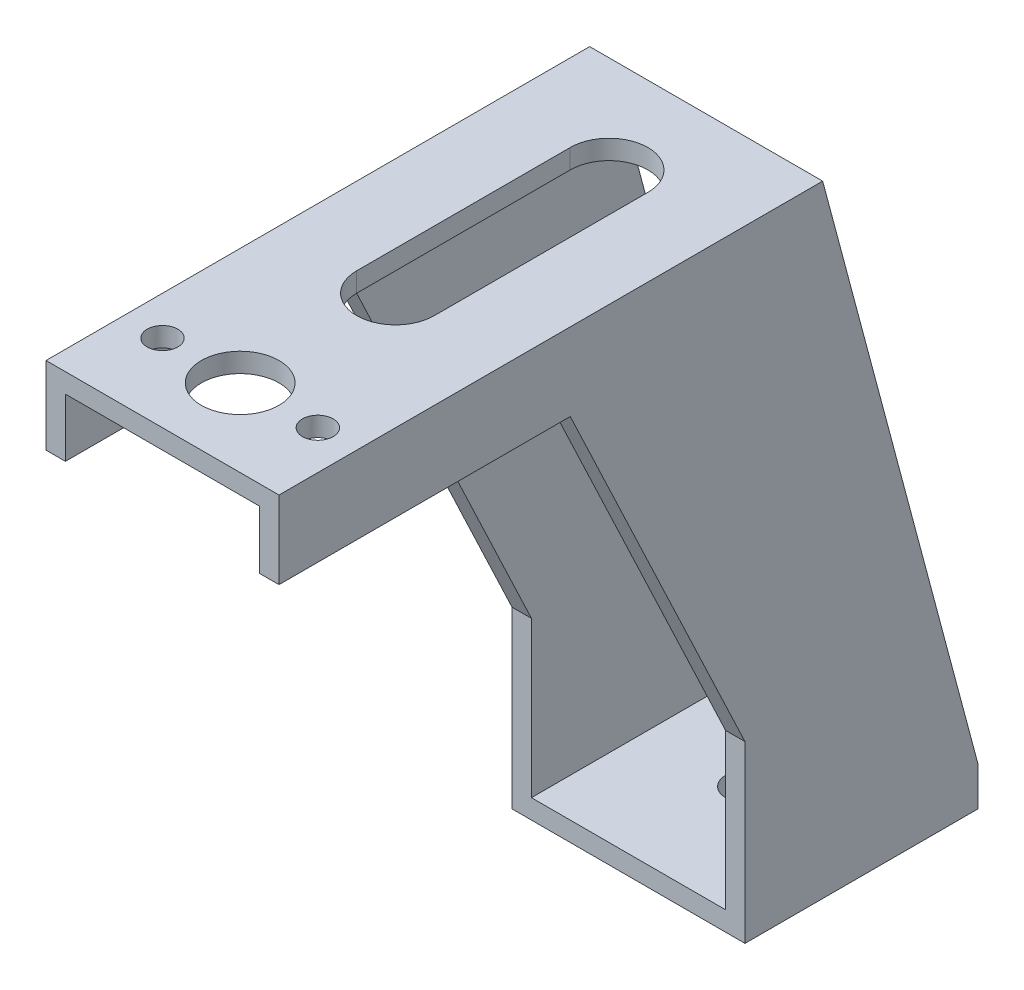
ISO-10303-21;
HEADER;
FILE_DESCRIPTION(('STEP AP214'),'2;1');
FILE_NAME('part.step','',(''),(''),'','','');
FILE_SCHEMA(('AUTOMOTIVE_DESIGN { 1 0 10303 214 1 1 1 1 }'));
ENDSEC;
DATA;
#1=APPLICATION_CONTEXT('core data for automotive mechanical design processes');
#2=APPLICATION_PROTOCOL_DEFINITION('international standard','automotive_design',2000,#1);
#3=PRODUCT_CONTEXT('',#1,'mechanical');
#4=PRODUCT('Part','Part','',(#3));
#5=PRODUCT_RELATED_PRODUCT_CATEGORY('part','',(#4));
#6=PRODUCT_DEFINITION_FORMATION('','',#4);
#7=PRODUCT_DEFINITION_CONTEXT('part definition',#1,'design');
#8=PRODUCT_DEFINITION('design','',#6,#7);
#9=PRODUCT_DEFINITION_SHAPE('','',#8);
#10=(LENGTH_UNIT() NAMED_UNIT(*) SI_UNIT(.MILLI.,.METRE.));
#11=(NAMED_UNIT(*) PLANE_ANGLE_UNIT() SI_UNIT($,.RADIAN.));
#12=(NAMED_UNIT(*) SI_UNIT($,.STERADIAN.) SOLID_ANGLE_UNIT());
#13=UNCERTAINTY_MEASURE_WITH_UNIT(LENGTH_MEASURE(1.E-05),#10,'distance_accuracy_value','');
#14=(GEOMETRIC_REPRESENTATION_CONTEXT(3) GLOBAL_UNCERTAINTY_ASSIGNED_CONTEXT((#13)) GLOBAL_UNIT_ASSIGNED_CONTEXT((#10,
#11,#12)) REPRESENTATION_CONTEXT('',''));
#15=CARTESIAN_POINT('',(0.,0.,0.));
#16=DIRECTION('',(0.,0.,1.));
#17=DIRECTION('',(1.,0.,0.));
#18=AXIS2_PLACEMENT_3D('',#15,#16,#17);
#19=CARTESIAN_POINT('',(0.,0.,114.3));
#20=DIRECTION('',(0.,0.,-1.));
#21=DIRECTION('',(-1.,0.,0.));
#22=AXIS2_PLACEMENT_3D('',#19,#20,#21);
#23=PLANE('',#22);
#24=DIRECTION('',(-1.,0.,0.));
#25=VECTOR('',#24,1.);
#26=CARTESIAN_POINT('',(38.1,88.9,114.3));
#27=LINE('',#26,#25);
#28=CARTESIAN_POINT('',(38.1,88.9,114.3));
#29=VERTEX_POINT('',#28);
#30=CARTESIAN_POINT('',(34.925,88.9,114.3));
#31=VERTEX_POINT('',#30);
#32=EDGE_CURVE('E253',#29,#31,#27,.T.);
#33=ORIENTED_EDGE('',*,*,#32,.F.);
#34=DIRECTION('',(0.,1.,0.));
#35=VECTOR('',#34,1.);
#36=CARTESIAN_POINT('',(38.1,0.,114.3));
#37=LINE('',#36,#35);
#38=CARTESIAN_POINT('',(38.1,101.6,114.3));
#39=VERTEX_POINT('',#38);
#40=EDGE_CURVE('E322',#29,#39,#37,.T.);
#41=ORIENTED_EDGE('',*,*,#40,.T.);
#42=DIRECTION('',(-1.,0.,0.));
#43=VECTOR('',#42,1.);
#44=CARTESIAN_POINT('',(0.,101.6,114.3));
#45=LINE('',#44,#43);
#46=CARTESIAN_POINT('',(0.,101.6,114.3));
#47=VERTEX_POINT('',#46);
#48=EDGE_CURVE('E325',#39,#47,#45,.T.);
#49=ORIENTED_EDGE('',*,*,#48,.T.);
#50=DIRECTION('',(0.,-1.,0.));
#51=VECTOR('',#50,1.);
#52=CARTESIAN_POINT('',(0.,0.,114.3));
#53=LINE('',#52,#51);
#54=CARTESIAN_POINT('',(0.,88.9,114.3));
#55=VERTEX_POINT('',#54);
#56=EDGE_CURVE('E319',#47,#55,#53,.T.);
#57=ORIENTED_EDGE('',*,*,#56,.T.);
#58=CARTESIAN_POINT('',(3.17500000000001,88.9,114.3));
#59=VERTEX_POINT('',#58);
#60=EDGE_CURVE('E256',#59,#55,#27,.T.);
#61=ORIENTED_EDGE('',*,*,#60,.F.);
#62=DIRECTION('',(0.,-1.,0.));
#63=VECTOR('',#62,1.);
#64=CARTESIAN_POINT('',(3.175,3.175,114.3));
#65=LINE('',#64,#63);
#66=CARTESIAN_POINT('',(3.175,98.425,114.3));
#67=VERTEX_POINT('',#66);
#68=EDGE_CURVE('E293',#67,#59,#65,.T.);
#69=ORIENTED_EDGE('',*,*,#68,.F.);
#70=DIRECTION('',(-1.,0.,0.));
#71=VECTOR('',#70,1.);
#72=CARTESIAN_POINT('',(3.175,98.425,114.3));
#73=LINE('',#72,#71);
#74=CARTESIAN_POINT('',(34.925,98.425,114.3));
#75=VERTEX_POINT('',#74);
#76=EDGE_CURVE('E299',#75,#67,#73,.T.);
#77=ORIENTED_EDGE('',*,*,#76,.F.);
#78=DIRECTION('',(0.,1.,0.));
#79=VECTOR('',#78,1.);
#80=CARTESIAN_POINT('',(34.925,3.175,114.3));
#81=LINE('',#80,#79);
#82=EDGE_CURVE('E296',#31,#75,#81,.T.);
#83=ORIENTED_EDGE('',*,*,#82,.F.);
#84=EDGE_LOOP('',(#33,#41,#49,#57,#61,#69,#77,#83));
#85=FACE_BOUND('',#84,.T.);
#86=ADVANCED_FACE('F35',(#85),#23,.F.);
#87=CARTESIAN_POINT('',(0.,0.,114.3));
#88=DIRECTION('',(1.,0.,0.));
#89=DIRECTION('',(0.,0.,-1.));
#90=AXIS2_PLACEMENT_3D('',#87,#88,#89);
#91=PLANE('',#90);
#92=DIRECTION('',(0.,0.,1.));
#93=VECTOR('',#92,1.);
#94=CARTESIAN_POINT('',(0.,88.9,0.));
#95=LINE('',#94,#93);
#96=CARTESIAN_POINT('',(0.,88.9,66.675));
#97=VERTEX_POINT('',#96);
#98=EDGE_CURVE('E235',#97,#55,#95,.T.);
#99=ORIENTED_EDGE('',*,*,#98,.T.);
#100=ORIENTED_EDGE('',*,*,#56,.F.);
#101=DIRECTION('',(0.,0.,-1.));
#102=VECTOR('',#101,1.);
#103=CARTESIAN_POINT('',(0.,101.6,114.3));
#104=LINE('',#103,#102);
#105=CARTESIAN_POINT('',(0.,101.6,25.4));
#106=VERTEX_POINT('',#105);
#107=EDGE_CURVE('E327',#47,#106,#104,.T.);
#108=ORIENTED_EDGE('',*,*,#107,.T.);
#109=DIRECTION('',(0.,0.966234939601246,0.257662650560332));
#110=VECTOR('',#109,1.);
#111=CARTESIAN_POINT('',(0.,0.421576763485477,-1.58091286307054));
#112=LINE('',#111,#110);
#113=CARTESIAN_POINT('',(0.,6.35,0.));
#114=VERTEX_POINT('',#113);
#115=EDGE_CURVE('E277',#114,#106,#112,.T.);
#116=ORIENTED_EDGE('',*,*,#115,.F.);
#117=DIRECTION('',(0.,-1.,0.));
#118=VECTOR('',#117,1.);
#119=CARTESIAN_POINT('',(0.,0.,0.));
#120=LINE('',#119,#118);
#121=CARTESIAN_POINT('',(0.,0.,0.));
#122=VERTEX_POINT('',#121);
#123=EDGE_CURVE('E318',#114,#122,#120,.T.);
#124=ORIENTED_EDGE('',*,*,#123,.T.);
#125=DIRECTION('',(0.,0.,-1.));
#126=VECTOR('',#125,1.);
#127=CARTESIAN_POINT('',(0.,0.,114.3));
#128=LINE('',#127,#126);
#129=CARTESIAN_POINT('',(0.,0.,38.1));
#130=VERTEX_POINT('',#129);
#131=EDGE_CURVE('E342',#130,#122,#128,.T.);
#132=ORIENTED_EDGE('',*,*,#131,.F.);
#133=DIRECTION('',(0.,1.,0.));
#134=VECTOR('',#133,1.);
#135=CARTESIAN_POINT('',(0.,0.,38.1));
#136=LINE('',#135,#134);
#137=CARTESIAN_POINT('',(0.,28.575,38.1));
#138=VERTEX_POINT('',#137);
#139=EDGE_CURVE('E241',#130,#138,#136,.T.);
#140=ORIENTED_EDGE('',*,*,#139,.T.);
#141=DIRECTION('',(0.,0.903737838893539,0.428086344739045));
#142=VECTOR('',#141,1.);
#143=CARTESIAN_POINT('',(0.,-9.50345022624434,20.0628393665158));
#144=LINE('',#143,#142);
#145=EDGE_CURVE('E248',#138,#97,#144,.T.);
#146=ORIENTED_EDGE('',*,*,#145,.T.);
#147=EDGE_LOOP('',(#99,#100,#108,#116,#124,#132,#140,#146));
#148=FACE_BOUND('',#147,.T.);
#149=ADVANCED_FACE('F37',(#148),#91,.F.);
#150=CARTESIAN_POINT('',(0.,0.,114.3));
#151=DIRECTION('',(0.,1.,0.));
#152=DIRECTION('',(0.,0.,1.));
#153=AXIS2_PLACEMENT_3D('',#150,#151,#152);
#154=PLANE('',#153);
#155=CARTESIAN_POINT('',(19.05,0.,19.05));
#156=DIRECTION('',(0.,-1.,0.));
#157=DIRECTION('',(0.,0.,-1.));
#158=AXIS2_PLACEMENT_3D('',#155,#156,#157);
#159=CIRCLE('',#158,3.175);
#160=CARTESIAN_POINT('',(19.05,0.,15.875));
#161=VERTEX_POINT('',#160);
#162=EDGE_CURVE('E220',#161,#161,#159,.T.);
#163=ORIENTED_EDGE('',*,*,#162,.F.);
#164=EDGE_LOOP('',(#163));
#165=FACE_BOUND('',#164,.T.);
#166=CARTESIAN_POINT('',(6.35,0.,6.35));
#167=DIRECTION('',(0.,-1.,0.));
#168=DIRECTION('',(0.,0.,-1.));
#169=AXIS2_PLACEMENT_3D('',#166,#167,#168);
#170=CIRCLE('',#169,2.4003);
#171=CARTESIAN_POINT('',(6.35,0.,3.9497));
#172=VERTEX_POINT('',#171);
#173=EDGE_CURVE('E226',#172,#172,#170,.T.);
#174=ORIENTED_EDGE('',*,*,#173,.F.);
#175=EDGE_LOOP('',(#174));
#176=FACE_BOUND('',#175,.T.);
#177=CARTESIAN_POINT('',(31.75,0.,6.35));
#178=DIRECTION('',(0.,-1.,0.));
#179=DIRECTION('',(0.,0.,-1.));
#180=AXIS2_PLACEMENT_3D('',#177,#178,#179);
#181=CIRCLE('',#180,2.4003);
#182=CARTESIAN_POINT('',(31.75,0.,3.9497));
#183=VERTEX_POINT('',#182);
#184=EDGE_CURVE('E232',#183,#183,#181,.T.);
#185=ORIENTED_EDGE('',*,*,#184,.F.);
#186=EDGE_LOOP('',(#185));
#187=FACE_BOUND('',#186,.T.);
#188=DIRECTION('',(-1.,0.,0.));
#189=VECTOR('',#188,1.);
#190=CARTESIAN_POINT('',(38.1,0.,38.1));
#191=LINE('',#190,#189);
#192=CARTESIAN_POINT('',(38.1,0.,38.1));
#193=VERTEX_POINT('',#192);
#194=EDGE_CURVE('E257',#193,#130,#191,.T.);
#195=ORIENTED_EDGE('',*,*,#194,.T.);
#196=ORIENTED_EDGE('',*,*,#131,.T.);
#197=DIRECTION('',(1.,0.,0.));
#198=VECTOR('',#197,1.);
#199=CARTESIAN_POINT('',(0.,0.,0.));
#200=LINE('',#199,#198);
#201=CARTESIAN_POINT('',(38.1,0.,0.));
#202=VERTEX_POINT('',#201);
#203=EDGE_CURVE('E330',#122,#202,#200,.T.);
#204=ORIENTED_EDGE('',*,*,#203,.T.);
#205=DIRECTION('',(0.,0.,-1.));
#206=VECTOR('',#205,1.);
#207=CARTESIAN_POINT('',(38.1,0.,114.3));
#208=LINE('',#207,#206);
#209=EDGE_CURVE('E340',#193,#202,#208,.T.);
#210=ORIENTED_EDGE('',*,*,#209,.F.);
#211=EDGE_LOOP('',(#195,#196,#204,#210));
#212=FACE_BOUND('',#211,.T.);
#213=ADVANCED_FACE('F408',(#165,#176,#187,#212),#154,.F.);
#214=CARTESIAN_POINT('',(38.1,0.,114.3));
#215=DIRECTION('',(-1.,0.,0.));
#216=DIRECTION('',(0.,0.,1.));
#217=AXIS2_PLACEMENT_3D('',#214,#215,#216);
#218=PLANE('',#217);
#219=DIRECTION('',(0.,0.,1.));
#220=VECTOR('',#219,1.);
#221=CARTESIAN_POINT('',(38.1,88.9,0.));
#222=LINE('',#221,#220);
#223=CARTESIAN_POINT('',(38.1,88.9,66.675));
#224=VERTEX_POINT('',#223);
#225=EDGE_CURVE('E238',#224,#29,#222,.T.);
#226=ORIENTED_EDGE('',*,*,#225,.F.);
#227=DIRECTION('',(0.,0.903737838893539,0.428086344739045));
#228=VECTOR('',#227,1.);
#229=CARTESIAN_POINT('',(38.1,-9.50345022624434,20.0628393665158));
#230=LINE('',#229,#228);
#231=CARTESIAN_POINT('',(38.1,28.575,38.1));
#232=VERTEX_POINT('',#231);
#233=EDGE_CURVE('E240',#232,#224,#230,.T.);
#234=ORIENTED_EDGE('',*,*,#233,.F.);
#235=DIRECTION('',(0.,1.,0.));
#236=VECTOR('',#235,1.);
#237=CARTESIAN_POINT('',(38.1,0.,38.1));
#238=LINE('',#237,#236);
#239=EDGE_CURVE('E243',#193,#232,#238,.T.);
#240=ORIENTED_EDGE('',*,*,#239,.F.);
#241=ORIENTED_EDGE('',*,*,#209,.T.);
#242=DIRECTION('',(0.,1.,0.));
#243=VECTOR('',#242,1.);
#244=CARTESIAN_POINT('',(38.1,0.,0.));
#245=LINE('',#244,#243);
#246=CARTESIAN_POINT('',(38.1,6.35,0.));
#247=VERTEX_POINT('',#246);
#248=EDGE_CURVE('E323',#202,#247,#245,.T.);
#249=ORIENTED_EDGE('',*,*,#248,.T.);
#250=DIRECTION('',(0.,0.966234939601246,0.257662650560332));
#251=VECTOR('',#250,1.);
#252=CARTESIAN_POINT('',(38.1,0.421576763485477,-1.58091286307054));
#253=LINE('',#252,#251);
#254=CARTESIAN_POINT('',(38.1,101.6,25.4));
#255=VERTEX_POINT('',#254);
#256=EDGE_CURVE('E278',#247,#255,#253,.T.);
#257=ORIENTED_EDGE('',*,*,#256,.T.);
#258=DIRECTION('',(0.,0.,-1.));
#259=VECTOR('',#258,1.);
#260=CARTESIAN_POINT('',(38.1,101.6,114.3));
#261=LINE('',#260,#259);
#262=EDGE_CURVE('E337',#39,#255,#261,.T.);
#263=ORIENTED_EDGE('',*,*,#262,.F.);
#264=ORIENTED_EDGE('',*,*,#40,.F.);
#265=EDGE_LOOP('',(#226,#234,#240,#241,#249,#257,#263,#264));
#266=FACE_BOUND('',#265,.T.);
#267=ADVANCED_FACE('F383',(#266),#218,.F.);
#268=CARTESIAN_POINT('',(3.175,3.175,114.3));
#269=DIRECTION('',(1.,0.,0.));
#270=DIRECTION('',(0.,0.,-1.));
#271=AXIS2_PLACEMENT_3D('',#268,#269,#270);
#272=PLANE('',#271);
#273=ORIENTED_EDGE('',*,*,#68,.T.);
#274=DIRECTION('',(0.,0.,-1.));
#275=VECTOR('',#274,1.);
#276=CARTESIAN_POINT('',(3.175,88.9,114.3));
#277=LINE('',#276,#275);
#278=CARTESIAN_POINT('',(3.17500000000001,88.9,66.675));
#279=VERTEX_POINT('',#278);
#280=EDGE_CURVE('E274',#59,#279,#277,.T.);
#281=ORIENTED_EDGE('',*,*,#280,.T.);
#282=DIRECTION('',(0.,-0.903737838893539,-0.428086344739045));
#283=VECTOR('',#282,1.);
#284=CARTESIAN_POINT('',(3.175,37.3098416289593,42.237556561086));
#285=LINE('',#284,#283);
#286=CARTESIAN_POINT('',(3.17500000000001,28.575,38.1));
#287=VERTEX_POINT('',#286);
#288=EDGE_CURVE('E255',#279,#287,#285,.T.);
#289=ORIENTED_EDGE('',*,*,#288,.T.);
#290=DIRECTION('',(0.,-1.,0.));
#291=VECTOR('',#290,1.);
#292=CARTESIAN_POINT('',(3.175,3.175,38.1));
#293=LINE('',#292,#291);
#294=CARTESIAN_POINT('',(3.175,3.175,38.1));
#295=VERTEX_POINT('',#294);
#296=EDGE_CURVE('E271',#287,#295,#293,.T.);
#297=ORIENTED_EDGE('',*,*,#296,.T.);
#298=DIRECTION('',(0.,0.,-1.));
#299=VECTOR('',#298,1.);
#300=CARTESIAN_POINT('',(3.175,3.175,114.3));
#301=LINE('',#300,#299);
#302=CARTESIAN_POINT('',(3.175,3.175,0.));
#303=VERTEX_POINT('',#302);
#304=EDGE_CURVE('E316',#295,#303,#301,.T.);
#305=ORIENTED_EDGE('',*,*,#304,.T.);
#306=DIRECTION('',(0.,-1.,0.));
#307=VECTOR('',#306,1.);
#308=CARTESIAN_POINT('',(3.175,3.175,0.));
#309=LINE('',#308,#307);
#310=CARTESIAN_POINT('',(3.17500000000001,6.35,0.));
#311=VERTEX_POINT('',#310);
#312=EDGE_CURVE('E292',#311,#303,#309,.T.);
#313=ORIENTED_EDGE('',*,*,#312,.F.);
#314=DIRECTION('',(0.,-0.966234939601246,-0.257662650560332));
#315=VECTOR('',#314,1.);
#316=CARTESIAN_POINT('',(3.175,31.8422199170125,6.79792531120332));
#317=LINE('',#316,#315);
#318=CARTESIAN_POINT('',(3.175,98.425,24.5533333333333));
#319=VERTEX_POINT('',#318);
#320=EDGE_CURVE('E290',#319,#311,#317,.T.);
#321=ORIENTED_EDGE('',*,*,#320,.F.);
#322=DIRECTION('',(0.,0.,-1.));
#323=VECTOR('',#322,1.);
#324=CARTESIAN_POINT('',(3.175,98.425,114.3));
#325=LINE('',#324,#323);
#326=EDGE_CURVE('E301',#67,#319,#325,.T.);
#327=ORIENTED_EDGE('',*,*,#326,.F.);
#328=EDGE_LOOP('',(#273,#281,#289,#297,#305,#313,#321,#327));
#329=FACE_BOUND('',#328,.T.);
#330=ADVANCED_FACE('F362',(#329),#272,.T.);
#331=CARTESIAN_POINT('',(3.175,3.175,114.3));
#332=DIRECTION('',(0.,1.,0.));
#333=DIRECTION('',(0.,0.,1.));
#334=AXIS2_PLACEMENT_3D('',#331,#332,#333);
#335=PLANE('',#334);
#336=CARTESIAN_POINT('',(19.05,3.175,19.05));
#337=DIRECTION('',(0.,1.,0.));
#338=DIRECTION('',(0.,0.,1.));
#339=AXIS2_PLACEMENT_3D('',#336,#337,#338);
#340=CIRCLE('',#339,3.175);
#341=CARTESIAN_POINT('',(19.05,3.175,22.225));
#342=VERTEX_POINT('',#341);
#343=EDGE_CURVE('E217',#342,#342,#340,.F.);
#344=ORIENTED_EDGE('',*,*,#343,.T.);
#345=EDGE_LOOP('',(#344));
#346=FACE_BOUND('',#345,.T.);
#347=CARTESIAN_POINT('',(6.35,3.175,6.35));
#348=DIRECTION('',(0.,1.,0.));
#349=DIRECTION('',(0.,0.,1.));
#350=AXIS2_PLACEMENT_3D('',#347,#348,#349);
#351=CIRCLE('',#350,2.4003);
#352=CARTESIAN_POINT('',(6.35,3.175,8.7503));
#353=VERTEX_POINT('',#352);
#354=EDGE_CURVE('E223',#353,#353,#351,.F.);
#355=ORIENTED_EDGE('',*,*,#354,.T.);
#356=EDGE_LOOP('',(#355));
#357=FACE_BOUND('',#356,.T.);
#358=CARTESIAN_POINT('',(31.75,3.175,6.35));
#359=DIRECTION('',(0.,1.,0.));
#360=DIRECTION('',(0.,0.,1.));
#361=AXIS2_PLACEMENT_3D('',#358,#359,#360);
#362=CIRCLE('',#361,2.4003);
#363=CARTESIAN_POINT('',(31.75,3.175,8.7503));
#364=VERTEX_POINT('',#363);
#365=EDGE_CURVE('E229',#364,#364,#362,.F.);
#366=ORIENTED_EDGE('',*,*,#365,.T.);
#367=EDGE_LOOP('',(#366));
#368=FACE_BOUND('',#367,.T.);
#369=ORIENTED_EDGE('',*,*,#304,.F.);
#370=DIRECTION('',(1.,0.,0.));
#371=VECTOR('',#370,1.);
#372=CARTESIAN_POINT('',(3.175,3.175,38.1));
#373=LINE('',#372,#371);
#374=CARTESIAN_POINT('',(34.925,3.175,38.1));
#375=VERTEX_POINT('',#374);
#376=EDGE_CURVE('E268',#295,#375,#373,.T.);
#377=ORIENTED_EDGE('',*,*,#376,.T.);
#378=DIRECTION('',(0.,0.,-1.));
#379=VECTOR('',#378,1.);
#380=CARTESIAN_POINT('',(34.925,3.175,114.3));
#381=LINE('',#380,#379);
#382=CARTESIAN_POINT('',(34.925,3.175,0.));
#383=VERTEX_POINT('',#382);
#384=EDGE_CURVE('E314',#375,#383,#381,.T.);
#385=ORIENTED_EDGE('',*,*,#384,.T.);
#386=DIRECTION('',(1.,0.,0.));
#387=VECTOR('',#386,1.);
#388=CARTESIAN_POINT('',(3.175,3.175,0.));
#389=LINE('',#388,#387);
#390=EDGE_CURVE('E304',#303,#383,#389,.T.);
#391=ORIENTED_EDGE('',*,*,#390,.F.);
#392=EDGE_LOOP('',(#369,#377,#385,#391));
#393=FACE_BOUND('',#392,.T.);
#394=ADVANCED_FACE('F358',(#346,#357,#368,#393),#335,.T.);
#395=CARTESIAN_POINT('',(34.925,3.175,114.3));
#396=DIRECTION('',(-1.,0.,0.));
#397=DIRECTION('',(0.,0.,1.));
#398=AXIS2_PLACEMENT_3D('',#395,#396,#397);
#399=PLANE('',#398);
#400=DIRECTION('',(0.,0.903737838893539,0.428086344739045));
#401=VECTOR('',#400,1.);
#402=CARTESIAN_POINT('',(34.925,37.3098416289593,42.237556561086));
#403=LINE('',#402,#401);
#404=CARTESIAN_POINT('',(34.925,28.575,38.1));
#405=VERTEX_POINT('',#404);
#406=CARTESIAN_POINT('',(34.925,88.9,66.675));
#407=VERTEX_POINT('',#406);
#408=EDGE_CURVE('E346',#405,#407,#403,.T.);
#409=ORIENTED_EDGE('',*,*,#408,.T.);
#410=DIRECTION('',(0.,0.,1.));
#411=VECTOR('',#410,1.);
#412=CARTESIAN_POINT('',(34.925,88.9,114.3));
#413=LINE('',#412,#411);
#414=EDGE_CURVE('E11',#407,#31,#413,.T.);
#415=ORIENTED_EDGE('',*,*,#414,.T.);
#416=ORIENTED_EDGE('',*,*,#82,.T.);
#417=DIRECTION('',(0.,0.,-1.));
#418=VECTOR('',#417,1.);
#419=CARTESIAN_POINT('',(34.925,98.425,114.3));
#420=LINE('',#419,#418);
#421=CARTESIAN_POINT('',(34.925,98.425,24.5533333333333));
#422=VERTEX_POINT('',#421);
#423=EDGE_CURVE('E311',#75,#422,#420,.T.);
#424=ORIENTED_EDGE('',*,*,#423,.T.);
#425=DIRECTION('',(0.,0.966234939601246,0.257662650560332));
#426=VECTOR('',#425,1.);
#427=CARTESIAN_POINT('',(34.925,31.8422199170125,6.79792531120332));
#428=LINE('',#427,#426);
#429=CARTESIAN_POINT('',(34.925,6.35,0.));
#430=VERTEX_POINT('',#429);
#431=EDGE_CURVE('E286',#430,#422,#428,.T.);
#432=ORIENTED_EDGE('',*,*,#431,.F.);
#433=DIRECTION('',(0.,1.,0.));
#434=VECTOR('',#433,1.);
#435=CARTESIAN_POINT('',(34.925,3.175,0.));
#436=LINE('',#435,#434);
#437=EDGE_CURVE('E297',#383,#430,#436,.T.);
#438=ORIENTED_EDGE('',*,*,#437,.F.);
#439=ORIENTED_EDGE('',*,*,#384,.F.);
#440=DIRECTION('',(0.,1.,0.));
#441=VECTOR('',#440,1.);
#442=CARTESIAN_POINT('',(34.925,3.175,38.1));
#443=LINE('',#442,#441);
#444=EDGE_CURVE('E43',#375,#405,#443,.T.);
#445=ORIENTED_EDGE('',*,*,#444,.T.);
#446=EDGE_LOOP('',(#409,#415,#416,#424,#432,#438,#439,#445));
#447=FACE_BOUND('',#446,.T.);
#448=ADVANCED_FACE('F351',(#447),#399,.T.);
#449=CARTESIAN_POINT('',(0.,0.,0.));
#450=DIRECTION('',(0.,0.,-1.));
#451=DIRECTION('',(-1.,0.,0.));
#452=AXIS2_PLACEMENT_3D('',#449,#450,#451);
#453=PLANE('',#452);
#454=DIRECTION('',(-1.,0.,0.));
#455=VECTOR('',#454,1.);
#456=CARTESIAN_POINT('',(38.1,6.35,0.));
#457=LINE('',#456,#455);
#458=EDGE_CURVE('E287',#247,#430,#457,.T.);
#459=ORIENTED_EDGE('',*,*,#458,.F.);
#460=ORIENTED_EDGE('',*,*,#248,.F.);
#461=ORIENTED_EDGE('',*,*,#203,.F.);
#462=ORIENTED_EDGE('',*,*,#123,.F.);
#463=EDGE_CURVE('E281',#311,#114,#457,.T.);
#464=ORIENTED_EDGE('',*,*,#463,.F.);
#465=ORIENTED_EDGE('',*,*,#312,.T.);
#466=ORIENTED_EDGE('',*,*,#390,.T.);
#467=ORIENTED_EDGE('',*,*,#437,.T.);
#468=EDGE_LOOP('',(#459,#460,#461,#462,#464,#465,#466,#467));
#469=FACE_BOUND('',#468,.T.);
#470=ADVANCED_FACE('F367',(#469),#453,.T.);
#471=CARTESIAN_POINT('',(0.,101.6,114.3));
#472=DIRECTION('',(0.,-1.,0.));
#473=DIRECTION('',(0.,0.,-1.));
#474=AXIS2_PLACEMENT_3D('',#471,#472,#473);
#475=PLANE('',#474);
#476=CARTESIAN_POINT('',(19.05,101.6,101.6));
#477=DIRECTION('',(0.,1.,0.));
#478=DIRECTION('',(0.,0.,1.));
#479=AXIS2_PLACEMENT_3D('',#476,#477,#478);
#480=CIRCLE('',#479,6.35);
#481=CARTESIAN_POINT('',(19.05,101.6,107.95));
#482=VERTEX_POINT('',#481);
#483=EDGE_CURVE('E437',#482,#482,#480,.T.);
#484=ORIENTED_EDGE('',*,*,#483,.F.);
#485=EDGE_LOOP('',(#484));
#486=FACE_BOUND('',#485,.T.);
#487=CARTESIAN_POINT('',(31.75,101.6,101.6));
#488=DIRECTION('',(0.,1.,0.));
#489=DIRECTION('',(0.,0.,1.));
#490=AXIS2_PLACEMENT_3D('',#487,#488,#489);
#491=CIRCLE('',#490,2.5146);
#492=CARTESIAN_POINT('',(31.75,101.6,104.1146));
#493=VERTEX_POINT('',#492);
#494=EDGE_CURVE('E194',#493,#493,#491,.T.);
#495=ORIENTED_EDGE('',*,*,#494,.F.);
#496=EDGE_LOOP('',(#495));
#497=FACE_BOUND('',#496,.T.);
#498=CARTESIAN_POINT('',(19.05,101.6,76.2));
#499=DIRECTION('',(0.,1.,0.));
#500=DIRECTION('',(0.,0.,1.));
#501=AXIS2_PLACEMENT_3D('',#498,#499,#500);
#502=CIRCLE('',#501,6.35);
#503=CARTESIAN_POINT('',(12.7,101.6,76.2));
#504=VERTEX_POINT('',#503);
#505=CARTESIAN_POINT('',(25.4,101.6,76.2));
#506=VERTEX_POINT('',#505);
#507=EDGE_CURVE('E187',#504,#506,#502,.T.);
#508=ORIENTED_EDGE('',*,*,#507,.F.);
#509=DIRECTION('',(0.,0.,1.));
#510=VECTOR('',#509,1.);
#511=CARTESIAN_POINT('',(12.7,101.6,41.275));
#512=LINE('',#511,#510);
#513=CARTESIAN_POINT('',(12.7,101.6,41.275));
#514=VERTEX_POINT('',#513);
#515=EDGE_CURVE('E204',#514,#504,#512,.T.);
#516=ORIENTED_EDGE('',*,*,#515,.F.);
#517=CARTESIAN_POINT('',(19.05,101.6,41.275));
#518=DIRECTION('',(0.,1.,0.));
#519=DIRECTION('',(0.,0.,1.));
#520=AXIS2_PLACEMENT_3D('',#517,#518,#519);
#521=CIRCLE('',#520,6.35);
#522=CARTESIAN_POINT('',(25.4,101.6,41.275));
#523=VERTEX_POINT('',#522);
#524=EDGE_CURVE('E202',#523,#514,#521,.T.);
#525=ORIENTED_EDGE('',*,*,#524,.F.);
#526=DIRECTION('',(0.,0.,-1.));
#527=VECTOR('',#526,1.);
#528=CARTESIAN_POINT('',(25.4,101.6,41.275));
#529=LINE('',#528,#527);
#530=EDGE_CURVE('E50',#506,#523,#529,.T.);
#531=ORIENTED_EDGE('',*,*,#530,.F.);
#532=EDGE_LOOP('',(#508,#516,#525,#531));
#533=FACE_BOUND('',#532,.T.);
#534=CARTESIAN_POINT('',(6.35,101.6,101.6));
#535=DIRECTION('',(0.,1.,0.));
#536=DIRECTION('',(0.,0.,1.));
#537=AXIS2_PLACEMENT_3D('',#534,#535,#536);
#538=CIRCLE('',#537,2.5146);
#539=CARTESIAN_POINT('',(6.35,101.6,104.1146));
#540=VERTEX_POINT('',#539);
#541=EDGE_CURVE('E214',#540,#540,#538,.T.);
#542=ORIENTED_EDGE('',*,*,#541,.F.);
#543=EDGE_LOOP('',(#542));
#544=FACE_BOUND('',#543,.T.);
#545=ORIENTED_EDGE('',*,*,#262,.T.);
#546=DIRECTION('',(-1.,0.,0.));
#547=VECTOR('',#546,1.);
#548=CARTESIAN_POINT('',(38.1,101.6,25.4));
#549=LINE('',#548,#547);
#550=EDGE_CURVE('E283',#255,#106,#549,.T.);
#551=ORIENTED_EDGE('',*,*,#550,.T.);
#552=ORIENTED_EDGE('',*,*,#107,.F.);
#553=ORIENTED_EDGE('',*,*,#48,.F.);
#554=EDGE_LOOP('',(#545,#551,#552,#553));
#555=FACE_BOUND('',#554,.T.);
#556=ADVANCED_FACE('F379',(#486,#497,#533,#544,#555),#475,.F.);
#557=CARTESIAN_POINT('',(3.175,98.425,114.3));
#558=DIRECTION('',(0.,-1.,0.));
#559=DIRECTION('',(0.,0.,-1.));
#560=AXIS2_PLACEMENT_3D('',#557,#558,#559);
#561=PLANE('',#560);
#562=CARTESIAN_POINT('',(19.05,98.425,101.6));
#563=DIRECTION('',(0.,-1.,0.));
#564=DIRECTION('',(0.,0.,-1.));
#565=AXIS2_PLACEMENT_3D('',#562,#563,#564);
#566=CIRCLE('',#565,6.35);
#567=CARTESIAN_POINT('',(19.05,98.425,95.25));
#568=VERTEX_POINT('',#567);
#569=EDGE_CURVE('E626',#568,#568,#566,.F.);
#570=ORIENTED_EDGE('',*,*,#569,.T.);
#571=EDGE_LOOP('',(#570));
#572=FACE_BOUND('',#571,.T.);
#573=CARTESIAN_POINT('',(31.75,98.425,101.6));
#574=DIRECTION('',(0.,-1.,0.));
#575=DIRECTION('',(0.,0.,-1.));
#576=AXIS2_PLACEMENT_3D('',#573,#574,#575);
#577=CIRCLE('',#576,2.5146);
#578=CARTESIAN_POINT('',(31.75,98.425,99.0854));
#579=VERTEX_POINT('',#578);
#580=EDGE_CURVE('E197',#579,#579,#577,.F.);
#581=ORIENTED_EDGE('',*,*,#580,.T.);
#582=EDGE_LOOP('',(#581));
#583=FACE_BOUND('',#582,.T.);
#584=DIRECTION('',(0.,0.,1.));
#585=VECTOR('',#584,1.);
#586=CARTESIAN_POINT('',(12.7,98.425,41.275));
#587=LINE('',#586,#585);
#588=CARTESIAN_POINT('',(12.7,98.425,41.275));
#589=VERTEX_POINT('',#588);
#590=CARTESIAN_POINT('',(12.7,98.425,76.2));
#591=VERTEX_POINT('',#590);
#592=EDGE_CURVE('E193',#589,#591,#587,.T.);
#593=ORIENTED_EDGE('',*,*,#592,.T.);
#594=CARTESIAN_POINT('',(19.05,98.425,76.2));
#595=DIRECTION('',(0.,-1.,0.));
#596=DIRECTION('',(0.,0.,-1.));
#597=AXIS2_PLACEMENT_3D('',#594,#595,#596);
#598=CIRCLE('',#597,6.35);
#599=CARTESIAN_POINT('',(25.4,98.425,76.2));
#600=VERTEX_POINT('',#599);
#601=EDGE_CURVE('E181',#591,#600,#598,.F.);
#602=ORIENTED_EDGE('',*,*,#601,.T.);
#603=DIRECTION('',(0.,0.,-1.));
#604=VECTOR('',#603,1.);
#605=CARTESIAN_POINT('',(25.4,98.425,41.275));
#606=LINE('',#605,#604);
#607=CARTESIAN_POINT('',(25.4,98.425,41.275));
#608=VERTEX_POINT('',#607);
#609=EDGE_CURVE('E171',#600,#608,#606,.T.);
#610=ORIENTED_EDGE('',*,*,#609,.T.);
#611=CARTESIAN_POINT('',(19.05,98.425,41.275));
#612=DIRECTION('',(0.,-1.,0.));
#613=DIRECTION('',(0.,0.,-1.));
#614=AXIS2_PLACEMENT_3D('',#611,#612,#613);
#615=CIRCLE('',#614,6.35);
#616=EDGE_CURVE('E180',#608,#589,#615,.F.);
#617=ORIENTED_EDGE('',*,*,#616,.T.);
#618=EDGE_LOOP('',(#593,#602,#610,#617));
#619=FACE_BOUND('',#618,.T.);
#620=CARTESIAN_POINT('',(6.35,98.425,101.6));
#621=DIRECTION('',(0.,-1.,0.));
#622=DIRECTION('',(0.,0.,-1.));
#623=AXIS2_PLACEMENT_3D('',#620,#621,#622);
#624=CIRCLE('',#623,2.5146);
#625=CARTESIAN_POINT('',(6.35,98.425,99.0854));
#626=VERTEX_POINT('',#625);
#627=EDGE_CURVE('E213',#626,#626,#624,.F.);
#628=ORIENTED_EDGE('',*,*,#627,.T.);
#629=EDGE_LOOP('',(#628));
#630=FACE_BOUND('',#629,.T.);
#631=DIRECTION('',(-1.,0.,0.));
#632=VECTOR('',#631,1.);
#633=CARTESIAN_POINT('',(3.175,98.425,24.5533333333333));
#634=LINE('',#633,#632);
#635=EDGE_CURVE('E344',#422,#319,#634,.T.);
#636=ORIENTED_EDGE('',*,*,#635,.F.);
#637=ORIENTED_EDGE('',*,*,#423,.F.);
#638=ORIENTED_EDGE('',*,*,#76,.T.);
#639=ORIENTED_EDGE('',*,*,#326,.T.);
#640=EDGE_LOOP('',(#636,#637,#638,#639));
#641=FACE_BOUND('',#640,.T.);
#642=ADVANCED_FACE('F191',(#572,#583,#619,#630,#641),#561,.T.);
#643=CARTESIAN_POINT('',(38.1,0.421576763485477,-1.58091286307054));
#644=DIRECTION('',(0.,-0.257662650560332,0.966234939601246));
#645=DIRECTION('',(0.,-0.966234939601246,-0.257662650560332));
#646=AXIS2_PLACEMENT_3D('',#643,#644,#645);
#647=PLANE('',#646);
#648=ORIENTED_EDGE('',*,*,#320,.T.);
#649=ORIENTED_EDGE('',*,*,#463,.T.);
#650=ORIENTED_EDGE('',*,*,#115,.T.);
#651=ORIENTED_EDGE('',*,*,#550,.F.);
#652=ORIENTED_EDGE('',*,*,#256,.F.);
#653=ORIENTED_EDGE('',*,*,#458,.T.);
#654=ORIENTED_EDGE('',*,*,#431,.T.);
#655=ORIENTED_EDGE('',*,*,#635,.T.);
#656=EDGE_LOOP('',(#648,#649,#650,#651,#652,#653,#654,#655));
#657=FACE_BOUND('',#656,.T.);
#658=ADVANCED_FACE('F372',(#657),#647,.F.);
#659=CARTESIAN_POINT('',(38.1,88.9,0.));
#660=DIRECTION('',(0.,-1.,0.));
#661=DIRECTION('',(0.,0.,-1.));
#662=AXIS2_PLACEMENT_3D('',#659,#660,#661);
#663=PLANE('',#662);
#664=ORIENTED_EDGE('',*,*,#60,.T.);
#665=ORIENTED_EDGE('',*,*,#98,.F.);
#666=DIRECTION('',(-1.,0.,0.));
#667=VECTOR('',#666,1.);
#668=CARTESIAN_POINT('',(38.1,88.9,66.675));
#669=LINE('',#668,#667);
#670=EDGE_CURVE('E245',#279,#97,#669,.T.);
#671=ORIENTED_EDGE('',*,*,#670,.F.);
#672=ORIENTED_EDGE('',*,*,#280,.F.);
#673=EDGE_LOOP('',(#664,#665,#671,#672));
#674=FACE_BOUND('',#673,.T.);
#675=ADVANCED_FACE('F401',(#674),#663,.T.);
#676=CARTESIAN_POINT('',(38.1,-9.50345022624434,20.0628393665158));
#677=DIRECTION('',(0.,-0.428086344739045,0.903737838893539));
#678=DIRECTION('',(0.,-0.903737838893539,-0.428086344739045));
#679=AXIS2_PLACEMENT_3D('',#676,#677,#678);
#680=PLANE('',#679);
#681=ORIENTED_EDGE('',*,*,#670,.T.);
#682=ORIENTED_EDGE('',*,*,#145,.F.);
#683=DIRECTION('',(-1.,0.,0.));
#684=VECTOR('',#683,1.);
#685=CARTESIAN_POINT('',(38.1,28.575,38.1));
#686=LINE('',#685,#684);
#687=EDGE_CURVE('E263',#287,#138,#686,.T.);
#688=ORIENTED_EDGE('',*,*,#687,.F.);
#689=ORIENTED_EDGE('',*,*,#288,.F.);
#690=EDGE_LOOP('',(#681,#682,#688,#689));
#691=FACE_BOUND('',#690,.T.);
#692=ADVANCED_FACE('F405',(#691),#680,.T.);
#693=EDGE_CURVE('E264',#224,#407,#669,.T.);
#694=ORIENTED_EDGE('',*,*,#693,.F.);
#695=ORIENTED_EDGE('',*,*,#225,.T.);
#696=ORIENTED_EDGE('',*,*,#32,.T.);
#697=ORIENTED_EDGE('',*,*,#414,.F.);
#698=EDGE_LOOP('',(#694,#695,#696,#697));
#699=FACE_BOUND('',#698,.T.);
#700=ADVANCED_FACE('F473',(#699),#663,.T.);
#701=CARTESIAN_POINT('',(38.1,0.,38.1));
#702=DIRECTION('',(0.,0.,1.));
#703=DIRECTION('',(1.,0.,0.));
#704=AXIS2_PLACEMENT_3D('',#701,#702,#703);
#705=PLANE('',#704);
#706=ORIENTED_EDGE('',*,*,#687,.T.);
#707=ORIENTED_EDGE('',*,*,#139,.F.);
#708=ORIENTED_EDGE('',*,*,#194,.F.);
#709=ORIENTED_EDGE('',*,*,#239,.T.);
#710=EDGE_CURVE('E260',#232,#405,#686,.T.);
#711=ORIENTED_EDGE('',*,*,#710,.T.);
#712=ORIENTED_EDGE('',*,*,#444,.F.);
#713=ORIENTED_EDGE('',*,*,#376,.F.);
#714=ORIENTED_EDGE('',*,*,#296,.F.);
#715=EDGE_LOOP('',(#706,#707,#708,#709,#711,#712,#713,#714));
#716=FACE_BOUND('',#715,.T.);
#717=ADVANCED_FACE('F354',(#716),#705,.T.);
#718=ORIENTED_EDGE('',*,*,#710,.F.);
#719=ORIENTED_EDGE('',*,*,#233,.T.);
#720=ORIENTED_EDGE('',*,*,#693,.T.);
#721=ORIENTED_EDGE('',*,*,#408,.F.);
#722=EDGE_LOOP('',(#718,#719,#720,#721));
#723=FACE_BOUND('',#722,.T.);
#724=ADVANCED_FACE('F469',(#723),#680,.T.);
#725=CARTESIAN_POINT('',(31.75,101.601,6.35));
#726=DIRECTION('',(0.,-1.,0.));
#727=DIRECTION('',(0.,0.,-1.));
#728=AXIS2_PLACEMENT_3D('',#725,#726,#727);
#729=CYLINDRICAL_SURFACE('',#728,2.4003);
#730=ORIENTED_EDGE('',*,*,#365,.F.);
#731=EDGE_LOOP('',(#730));
#732=FACE_BOUND('',#731,.T.);
#733=ORIENTED_EDGE('',*,*,#184,.T.);
#734=EDGE_LOOP('',(#733));
#735=FACE_BOUND('',#734,.T.);
#736=ADVANCED_FACE('F465',(#732,#735),#729,.F.);
#737=CARTESIAN_POINT('',(6.35,101.601,6.35));
#738=DIRECTION('',(0.,-1.,0.));
#739=DIRECTION('',(0.,0.,-1.));
#740=AXIS2_PLACEMENT_3D('',#737,#738,#739);
#741=CYLINDRICAL_SURFACE('',#740,2.4003);
#742=ORIENTED_EDGE('',*,*,#354,.F.);
#743=EDGE_LOOP('',(#742));
#744=FACE_BOUND('',#743,.T.);
#745=ORIENTED_EDGE('',*,*,#173,.T.);
#746=EDGE_LOOP('',(#745));
#747=FACE_BOUND('',#746,.T.);
#748=ADVANCED_FACE('F456',(#744,#747),#741,.F.);
#749=CARTESIAN_POINT('',(19.05,101.601,19.05));
#750=DIRECTION('',(0.,-1.,0.));
#751=DIRECTION('',(0.,0.,-1.));
#752=AXIS2_PLACEMENT_3D('',#749,#750,#751);
#753=CYLINDRICAL_SURFACE('',#752,3.175);
#754=ORIENTED_EDGE('',*,*,#343,.F.);
#755=EDGE_LOOP('',(#754));
#756=FACE_BOUND('',#755,.T.);
#757=ORIENTED_EDGE('',*,*,#162,.T.);
#758=EDGE_LOOP('',(#757));
#759=FACE_BOUND('',#758,.T.);
#760=ADVANCED_FACE('F447',(#756,#759),#753,.F.);
#761=CARTESIAN_POINT('',(6.35,-0.001000000000001,101.6));
#762=DIRECTION('',(0.,1.,0.));
#763=DIRECTION('',(0.,0.,1.));
#764=AXIS2_PLACEMENT_3D('',#761,#762,#763);
#765=CYLINDRICAL_SURFACE('',#764,2.5146);
#766=ORIENTED_EDGE('',*,*,#627,.F.);
#767=EDGE_LOOP('',(#766));
#768=FACE_BOUND('',#767,.T.);
#769=ORIENTED_EDGE('',*,*,#541,.T.);
#770=EDGE_LOOP('',(#769));
#771=FACE_BOUND('',#770,.T.);
#772=ADVANCED_FACE('F444',(#768,#771),#765,.F.);
#773=CARTESIAN_POINT('',(12.7,-0.001000000000001,41.275));
#774=DIRECTION('',(-1.,0.,0.));
#775=DIRECTION('',(0.,0.,1.));
#776=AXIS2_PLACEMENT_3D('',#773,#774,#775);
#777=PLANE('',#776);
#778=DIRECTION('',(0.,1.,0.));
#779=VECTOR('',#778,1.);
#780=CARTESIAN_POINT('',(12.7,-0.001000000000001,41.275));
#781=LINE('',#780,#779);
#782=EDGE_CURVE('E58',#589,#514,#781,.T.);
#783=ORIENTED_EDGE('',*,*,#782,.T.);
#784=ORIENTED_EDGE('',*,*,#515,.T.);
#785=DIRECTION('',(0.,1.,0.));
#786=VECTOR('',#785,1.);
#787=CARTESIAN_POINT('',(12.7,-0.001000000000001,76.2));
#788=LINE('',#787,#786);
#789=EDGE_CURVE('E188',#591,#504,#788,.T.);
#790=ORIENTED_EDGE('',*,*,#789,.F.);
#791=ORIENTED_EDGE('',*,*,#592,.F.);
#792=EDGE_LOOP('',(#783,#784,#790,#791));
#793=FACE_BOUND('',#792,.T.);
#794=ADVANCED_FACE('F446',(#793),#777,.F.);
#795=CARTESIAN_POINT('',(19.05,-0.001000000000001,76.2));
#796=DIRECTION('',(0.,1.,0.));
#797=DIRECTION('',(0.,0.,1.));
#798=AXIS2_PLACEMENT_3D('',#795,#796,#797);
#799=CYLINDRICAL_SURFACE('',#798,6.35);
#800=ORIENTED_EDGE('',*,*,#789,.T.);
#801=ORIENTED_EDGE('',*,*,#507,.T.);
#802=DIRECTION('',(0.,1.,0.));
#803=VECTOR('',#802,1.);
#804=CARTESIAN_POINT('',(25.4,-0.001000000000001,76.2));
#805=LINE('',#804,#803);
#806=EDGE_CURVE('E174',#600,#506,#805,.T.);
#807=ORIENTED_EDGE('',*,*,#806,.F.);
#808=ORIENTED_EDGE('',*,*,#601,.F.);
#809=EDGE_LOOP('',(#800,#801,#807,#808));
#810=FACE_BOUND('',#809,.T.);
#811=ADVANCED_FACE('F184',(#810),#799,.F.);
#812=CARTESIAN_POINT('',(25.4,-0.001000000000001,41.275));
#813=DIRECTION('',(1.,0.,0.));
#814=DIRECTION('',(0.,0.,-1.));
#815=AXIS2_PLACEMENT_3D('',#812,#813,#814);
#816=PLANE('',#815);
#817=ORIENTED_EDGE('',*,*,#806,.T.);
#818=ORIENTED_EDGE('',*,*,#530,.T.);
#819=DIRECTION('',(0.,1.,0.));
#820=VECTOR('',#819,1.);
#821=CARTESIAN_POINT('',(25.4,-0.001000000000001,41.275));
#822=LINE('',#821,#820);
#823=EDGE_CURVE('E176',#608,#523,#822,.T.);
#824=ORIENTED_EDGE('',*,*,#823,.F.);
#825=ORIENTED_EDGE('',*,*,#609,.F.);
#826=EDGE_LOOP('',(#817,#818,#824,#825));
#827=FACE_BOUND('',#826,.T.);
#828=ADVANCED_FACE('F173',(#827),#816,.F.);
#829=CARTESIAN_POINT('',(19.05,-0.001000000000001,41.275));
#830=DIRECTION('',(0.,1.,0.));
#831=DIRECTION('',(0.,0.,1.));
#832=AXIS2_PLACEMENT_3D('',#829,#830,#831);
#833=CYLINDRICAL_SURFACE('',#832,6.35);
#834=ORIENTED_EDGE('',*,*,#823,.T.);
#835=ORIENTED_EDGE('',*,*,#524,.T.);
#836=ORIENTED_EDGE('',*,*,#782,.F.);
#837=ORIENTED_EDGE('',*,*,#616,.F.);
#838=EDGE_LOOP('',(#834,#835,#836,#837));
#839=FACE_BOUND('',#838,.T.);
#840=ADVANCED_FACE('F461',(#839),#833,.F.);
#841=CARTESIAN_POINT('',(31.75,-0.001000000000001,101.6));
#842=DIRECTION('',(0.,1.,0.));
#843=DIRECTION('',(0.,0.,1.));
#844=AXIS2_PLACEMENT_3D('',#841,#842,#843);
#845=CYLINDRICAL_SURFACE('',#844,2.5146);
#846=ORIENTED_EDGE('',*,*,#580,.F.);
#847=EDGE_LOOP('',(#846));
#848=FACE_BOUND('',#847,.T.);
#849=ORIENTED_EDGE('',*,*,#494,.T.);
#850=EDGE_LOOP('',(#849));
#851=FACE_BOUND('',#850,.T.);
#852=ADVANCED_FACE('F599',(#848,#851),#845,.F.);
#853=CARTESIAN_POINT('',(19.05,-0.001000000000001,101.6));
#854=DIRECTION('',(0.,1.,0.));
#855=DIRECTION('',(0.,0.,1.));
#856=AXIS2_PLACEMENT_3D('',#853,#854,#855);
#857=CYLINDRICAL_SURFACE('',#856,6.35);
#858=ORIENTED_EDGE('',*,*,#569,.F.);
#859=EDGE_LOOP('',(#858));
#860=FACE_BOUND('',#859,.T.);
#861=ORIENTED_EDGE('',*,*,#483,.T.);
#862=EDGE_LOOP('',(#861));
#863=FACE_BOUND('',#862,.T.);
#864=ADVANCED_FACE('F606',(#860,#863),#857,.F.);
#865=CLOSED_SHELL('',(#86,#149,#213,#267,#330,#394,#448,#470,#556,#642,#658,#675,#692,#700,#717,
#724,#736,#748,#760,#772,#794,#811,#828,#840,#852,#864));
#866=MANIFOLD_SOLID_BREP('B2',#865);
#867=ADVANCED_BREP_SHAPE_REPRESENTATION('',(#18,#866),#14);
#868=SHAPE_DEFINITION_REPRESENTATION(#9,#867);
ENDSEC;
END-ISO-10303-21;
